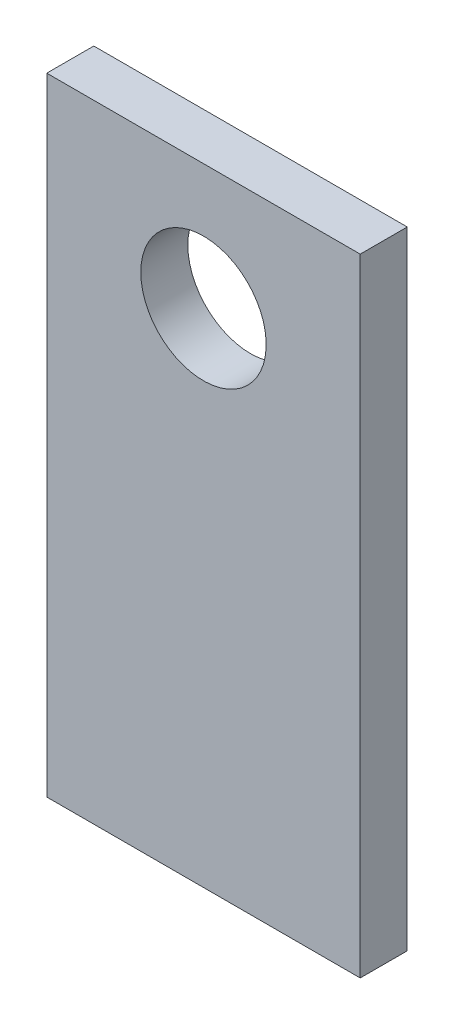
ISO-10303-21;
HEADER;
FILE_DESCRIPTION(('STEP AP214'),'2;1');
FILE_NAME('part.step','',(''),(''),'','','');
FILE_SCHEMA(('AUTOMOTIVE_DESIGN { 1 0 10303 214 1 1 1 1 }'));
ENDSEC;
DATA;
#1=APPLICATION_CONTEXT('core data for automotive mechanical design processes');
#2=APPLICATION_PROTOCOL_DEFINITION('international standard','automotive_design',2000,#1);
#3=PRODUCT_CONTEXT('',#1,'mechanical');
#4=PRODUCT('Part','Part','',(#3));
#5=PRODUCT_RELATED_PRODUCT_CATEGORY('part','',(#4));
#6=PRODUCT_DEFINITION_FORMATION('','',#4);
#7=PRODUCT_DEFINITION_CONTEXT('part definition',#1,'design');
#8=PRODUCT_DEFINITION('design','',#6,#7);
#9=PRODUCT_DEFINITION_SHAPE('','',#8);
#10=(LENGTH_UNIT() NAMED_UNIT(*) SI_UNIT(.MILLI.,.METRE.));
#11=(NAMED_UNIT(*) PLANE_ANGLE_UNIT() SI_UNIT($,.RADIAN.));
#12=(NAMED_UNIT(*) SI_UNIT($,.STERADIAN.) SOLID_ANGLE_UNIT());
#13=UNCERTAINTY_MEASURE_WITH_UNIT(LENGTH_MEASURE(1.E-05),#10,'distance_accuracy_value','');
#14=(GEOMETRIC_REPRESENTATION_CONTEXT(3) GLOBAL_UNCERTAINTY_ASSIGNED_CONTEXT((#13)) GLOBAL_UNIT_ASSIGNED_CONTEXT((#10,
#11,#12)) REPRESENTATION_CONTEXT('',''));
#15=CARTESIAN_POINT('',(0.,0.,0.));
#16=DIRECTION('',(0.,0.,1.));
#17=DIRECTION('',(1.,0.,0.));
#18=AXIS2_PLACEMENT_3D('',#15,#16,#17);
#19=CARTESIAN_POINT('',(0.,0.,9.525));
#20=DIRECTION('',(0.,0.,-1.));
#21=DIRECTION('',(-1.,0.,0.));
#22=AXIS2_PLACEMENT_3D('',#19,#20,#21);
#23=PLANE('',#22);
#24=DIRECTION('',(0.,-1.,0.));
#25=VECTOR('',#24,1.);
#26=CARTESIAN_POINT('',(0.,0.,9.525));
#27=LINE('',#26,#25);
#28=CARTESIAN_POINT('',(0.,127.,9.525));
#29=VERTEX_POINT('',#28);
#30=CARTESIAN_POINT('',(0.,0.,9.525));
#31=VERTEX_POINT('',#30);
#32=EDGE_CURVE('E85',#29,#31,#27,.T.);
#33=ORIENTED_EDGE('',*,*,#32,.T.);
#34=DIRECTION('',(1.,0.,0.));
#35=VECTOR('',#34,1.);
#36=CARTESIAN_POINT('',(0.,0.,9.525));
#37=LINE('',#36,#35);
#38=CARTESIAN_POINT('',(63.5,0.,9.525));
#39=VERTEX_POINT('',#38);
#40=EDGE_CURVE('E80',#31,#39,#37,.T.);
#41=ORIENTED_EDGE('',*,*,#40,.T.);
#42=DIRECTION('',(0.,1.,0.));
#43=VECTOR('',#42,1.);
#44=CARTESIAN_POINT('',(63.5,0.,9.525));
#45=LINE('',#44,#43);
#46=CARTESIAN_POINT('',(63.5,127.,9.525));
#47=VERTEX_POINT('',#46);
#48=EDGE_CURVE('E83',#39,#47,#45,.T.);
#49=ORIENTED_EDGE('',*,*,#48,.T.);
#50=DIRECTION('',(-1.,0.,0.));
#51=VECTOR('',#50,1.);
#52=CARTESIAN_POINT('',(0.,127.,9.525));
#53=LINE('',#52,#51);
#54=EDGE_CURVE('E50',#47,#29,#53,.T.);
#55=ORIENTED_EDGE('',*,*,#54,.T.);
#56=EDGE_LOOP('',(#33,#41,#49,#55));
#57=FACE_BOUND('',#56,.T.);
#58=CARTESIAN_POINT('',(31.75,101.6,9.525));
#59=DIRECTION('',(0.,0.,1.));
#60=DIRECTION('',(1.,0.,0.));
#61=AXIS2_PLACEMENT_3D('',#58,#59,#60);
#62=CIRCLE('',#61,12.7);
#63=CARTESIAN_POINT('',(19.05,101.6,9.525));
#64=VERTEX_POINT('',#63);
#65=EDGE_CURVE('E100',#64,#64,#62,.T.);
#66=ORIENTED_EDGE('',*,*,#65,.F.);
#67=EDGE_LOOP('',(#66));
#68=FACE_BOUND('',#67,.T.);
#69=ADVANCED_FACE('F33',(#57,#68),#23,.F.);
#70=CARTESIAN_POINT('',(0.,0.,0.));
#71=DIRECTION('',(0.,0.,-1.));
#72=DIRECTION('',(-1.,0.,0.));
#73=AXIS2_PLACEMENT_3D('',#70,#71,#72);
#74=PLANE('',#73);
#75=DIRECTION('',(0.,-1.,0.));
#76=VECTOR('',#75,1.);
#77=CARTESIAN_POINT('',(0.,0.,0.));
#78=LINE('',#77,#76);
#79=CARTESIAN_POINT('',(0.,127.,0.));
#80=VERTEX_POINT('',#79);
#81=CARTESIAN_POINT('',(0.,0.,0.));
#82=VERTEX_POINT('',#81);
#83=EDGE_CURVE('E97',#80,#82,#78,.T.);
#84=ORIENTED_EDGE('',*,*,#83,.F.);
#85=DIRECTION('',(-1.,0.,0.));
#86=VECTOR('',#85,1.);
#87=CARTESIAN_POINT('',(0.,127.,0.));
#88=LINE('',#87,#86);
#89=CARTESIAN_POINT('',(63.5,127.,0.));
#90=VERTEX_POINT('',#89);
#91=EDGE_CURVE('E73',#90,#80,#88,.T.);
#92=ORIENTED_EDGE('',*,*,#91,.F.);
#93=DIRECTION('',(0.,1.,0.));
#94=VECTOR('',#93,1.);
#95=CARTESIAN_POINT('',(63.5,0.,0.));
#96=LINE('',#95,#94);
#97=CARTESIAN_POINT('',(63.5,0.,0.));
#98=VERTEX_POINT('',#97);
#99=EDGE_CURVE('E67',#98,#90,#96,.T.);
#100=ORIENTED_EDGE('',*,*,#99,.F.);
#101=DIRECTION('',(1.,0.,0.));
#102=VECTOR('',#101,1.);
#103=CARTESIAN_POINT('',(0.,0.,0.));
#104=LINE('',#103,#102);
#105=EDGE_CURVE('E89',#82,#98,#104,.T.);
#106=ORIENTED_EDGE('',*,*,#105,.F.);
#107=EDGE_LOOP('',(#84,#92,#100,#106));
#108=FACE_BOUND('',#107,.T.);
#109=CARTESIAN_POINT('',(31.75,101.6,0.));
#110=DIRECTION('',(0.,0.,1.));
#111=DIRECTION('',(1.,0.,0.));
#112=AXIS2_PLACEMENT_3D('',#109,#110,#111);
#113=CIRCLE('',#112,12.7);
#114=CARTESIAN_POINT('',(19.05,101.6,0.));
#115=VERTEX_POINT('',#114);
#116=EDGE_CURVE('E112',#115,#115,#113,.T.);
#117=ORIENTED_EDGE('',*,*,#116,.T.);
#118=EDGE_LOOP('',(#117));
#119=FACE_BOUND('',#118,.T.);
#120=ADVANCED_FACE('F108',(#108,#119),#74,.T.);
#121=CARTESIAN_POINT('',(0.,0.,9.525));
#122=DIRECTION('',(1.,0.,0.));
#123=DIRECTION('',(0.,0.,-1.));
#124=AXIS2_PLACEMENT_3D('',#121,#122,#123);
#125=PLANE('',#124);
#126=ORIENTED_EDGE('',*,*,#83,.T.);
#127=DIRECTION('',(0.,0.,-1.));
#128=VECTOR('',#127,1.);
#129=CARTESIAN_POINT('',(0.,0.,9.525));
#130=LINE('',#129,#128);
#131=EDGE_CURVE('E11',#31,#82,#130,.T.);
#132=ORIENTED_EDGE('',*,*,#131,.F.);
#133=ORIENTED_EDGE('',*,*,#32,.F.);
#134=DIRECTION('',(0.,0.,-1.));
#135=VECTOR('',#134,1.);
#136=CARTESIAN_POINT('',(0.,127.,9.525));
#137=LINE('',#136,#135);
#138=EDGE_CURVE('E93',#29,#80,#137,.T.);
#139=ORIENTED_EDGE('',*,*,#138,.T.);
#140=EDGE_LOOP('',(#126,#132,#133,#139));
#141=FACE_BOUND('',#140,.T.);
#142=ADVANCED_FACE('F35',(#141),#125,.F.);
#143=CARTESIAN_POINT('',(0.,0.,9.525));
#144=DIRECTION('',(0.,1.,0.));
#145=DIRECTION('',(0.,0.,1.));
#146=AXIS2_PLACEMENT_3D('',#143,#144,#145);
#147=PLANE('',#146);
#148=ORIENTED_EDGE('',*,*,#105,.T.);
#149=DIRECTION('',(0.,0.,-1.));
#150=VECTOR('',#149,1.);
#151=CARTESIAN_POINT('',(63.5,0.,9.525));
#152=LINE('',#151,#150);
#153=EDGE_CURVE('E42',#39,#98,#152,.T.);
#154=ORIENTED_EDGE('',*,*,#153,.F.);
#155=ORIENTED_EDGE('',*,*,#40,.F.);
#156=ORIENTED_EDGE('',*,*,#131,.T.);
#157=EDGE_LOOP('',(#148,#154,#155,#156));
#158=FACE_BOUND('',#157,.T.);
#159=ADVANCED_FACE('F88',(#158),#147,.F.);
#160=CARTESIAN_POINT('',(63.5,0.,9.525));
#161=DIRECTION('',(-1.,0.,0.));
#162=DIRECTION('',(0.,0.,1.));
#163=AXIS2_PLACEMENT_3D('',#160,#161,#162);
#164=PLANE('',#163);
#165=ORIENTED_EDGE('',*,*,#99,.T.);
#166=DIRECTION('',(0.,0.,-1.));
#167=VECTOR('',#166,1.);
#168=CARTESIAN_POINT('',(63.5,127.,9.525));
#169=LINE('',#168,#167);
#170=EDGE_CURVE('E90',#47,#90,#169,.T.);
#171=ORIENTED_EDGE('',*,*,#170,.F.);
#172=ORIENTED_EDGE('',*,*,#48,.F.);
#173=ORIENTED_EDGE('',*,*,#153,.T.);
#174=EDGE_LOOP('',(#165,#171,#172,#173));
#175=FACE_BOUND('',#174,.T.);
#176=ADVANCED_FACE('F91',(#175),#164,.F.);
#177=CARTESIAN_POINT('',(0.,127.,9.525));
#178=DIRECTION('',(0.,-1.,0.));
#179=DIRECTION('',(0.,0.,-1.));
#180=AXIS2_PLACEMENT_3D('',#177,#178,#179);
#181=PLANE('',#180);
#182=ORIENTED_EDGE('',*,*,#91,.T.);
#183=ORIENTED_EDGE('',*,*,#138,.F.);
#184=ORIENTED_EDGE('',*,*,#54,.F.);
#185=ORIENTED_EDGE('',*,*,#170,.T.);
#186=EDGE_LOOP('',(#182,#183,#184,#185));
#187=FACE_BOUND('',#186,.T.);
#188=ADVANCED_FACE('F105',(#187),#181,.F.);
#189=CARTESIAN_POINT('',(31.75,101.6,9.525));
#190=DIRECTION('',(0.,0.,-1.));
#191=DIRECTION('',(-1.,0.,0.));
#192=AXIS2_PLACEMENT_3D('',#189,#190,#191);
#193=CYLINDRICAL_SURFACE('',#192,12.7);
#194=CARTESIAN_POINT('',(19.05,101.6,9.525));
#195=CARTESIAN_POINT('',(19.05,101.6,9.42578125));
#196=CARTESIAN_POINT('',(19.05,101.6,9.3265625));
#197=CARTESIAN_POINT('',(19.05,101.6,9.128125));
#198=CARTESIAN_POINT('',(19.05,101.6,9.02890625));
#199=CARTESIAN_POINT('',(19.05,101.6,8.83046875));
#200=CARTESIAN_POINT('',(19.05,101.6,8.73125));
#201=CARTESIAN_POINT('',(19.05,101.6,8.5328125));
#202=CARTESIAN_POINT('',(19.05,101.6,8.43359375));
#203=CARTESIAN_POINT('',(19.05,101.6,8.23515625));
#204=CARTESIAN_POINT('',(19.05,101.6,8.1359375));
#205=CARTESIAN_POINT('',(19.05,101.6,7.9375));
#206=CARTESIAN_POINT('',(19.05,101.6,7.83828125));
#207=CARTESIAN_POINT('',(19.05,101.6,7.63984375));
#208=CARTESIAN_POINT('',(19.05,101.6,7.540625));
#209=CARTESIAN_POINT('',(19.05,101.6,7.3421875));
#210=CARTESIAN_POINT('',(19.05,101.6,7.24296875));
#211=CARTESIAN_POINT('',(19.05,101.6,7.04453125));
#212=CARTESIAN_POINT('',(19.05,101.6,6.9453125));
#213=CARTESIAN_POINT('',(19.05,101.6,6.746875));
#214=CARTESIAN_POINT('',(19.05,101.6,6.64765625));
#215=CARTESIAN_POINT('',(19.05,101.6,6.44921875));
#216=CARTESIAN_POINT('',(19.05,101.6,6.35));
#217=CARTESIAN_POINT('',(19.05,101.6,6.1515625));
#218=CARTESIAN_POINT('',(19.05,101.6,6.05234375));
#219=CARTESIAN_POINT('',(19.05,101.6,5.85390625));
#220=CARTESIAN_POINT('',(19.05,101.6,5.7546875));
#221=CARTESIAN_POINT('',(19.05,101.6,5.55625));
#222=CARTESIAN_POINT('',(19.05,101.6,5.45703125));
#223=CARTESIAN_POINT('',(19.05,101.6,5.25859375));
#224=CARTESIAN_POINT('',(19.05,101.6,5.159375));
#225=CARTESIAN_POINT('',(19.05,101.6,4.9609375));
#226=CARTESIAN_POINT('',(19.05,101.6,4.86171875));
#227=CARTESIAN_POINT('',(19.05,101.6,4.66328125));
#228=CARTESIAN_POINT('',(19.05,101.6,4.5640625));
#229=CARTESIAN_POINT('',(19.05,101.6,4.365625));
#230=CARTESIAN_POINT('',(19.05,101.6,4.26640625));
#231=CARTESIAN_POINT('',(19.05,101.6,4.06796875));
#232=CARTESIAN_POINT('',(19.05,101.6,3.96875));
#233=CARTESIAN_POINT('',(19.05,101.6,3.7703125));
#234=CARTESIAN_POINT('',(19.05,101.6,3.67109375));
#235=CARTESIAN_POINT('',(19.05,101.6,3.47265625));
#236=CARTESIAN_POINT('',(19.05,101.6,3.3734375));
#237=CARTESIAN_POINT('',(19.05,101.6,3.175));
#238=CARTESIAN_POINT('',(19.05,101.6,3.07578125));
#239=CARTESIAN_POINT('',(19.05,101.6,2.87734375));
#240=CARTESIAN_POINT('',(19.05,101.6,2.778125));
#241=CARTESIAN_POINT('',(19.05,101.6,2.5796875));
#242=CARTESIAN_POINT('',(19.05,101.6,2.48046875));
#243=CARTESIAN_POINT('',(19.05,101.6,2.28203125));
#244=CARTESIAN_POINT('',(19.05,101.6,2.1828125));
#245=CARTESIAN_POINT('',(19.05,101.6,1.984375));
#246=CARTESIAN_POINT('',(19.05,101.6,1.88515625));
#247=CARTESIAN_POINT('',(19.05,101.6,1.68671875));
#248=CARTESIAN_POINT('',(19.05,101.6,1.5875));
#249=CARTESIAN_POINT('',(19.05,101.6,1.3890625));
#250=CARTESIAN_POINT('',(19.05,101.6,1.28984375));
#251=CARTESIAN_POINT('',(19.05,101.6,1.09140625));
#252=CARTESIAN_POINT('',(19.05,101.6,0.992187500000001));
#253=CARTESIAN_POINT('',(19.05,101.6,0.793750000000001));
#254=CARTESIAN_POINT('',(19.05,101.6,0.69453125));
#255=CARTESIAN_POINT('',(19.05,101.6,0.49609375));
#256=CARTESIAN_POINT('',(19.05,101.6,0.396875));
#257=CARTESIAN_POINT('',(19.05,101.6,0.1984375));
#258=CARTESIAN_POINT('',(19.05,101.6,0.0992187500000001));
#259=CARTESIAN_POINT('',(19.05,101.6,0.));
#260=B_SPLINE_CURVE_WITH_KNOTS('',3,(#194,#195,#196,#197,#198,#199,#200,#201,#202,#203,#204,
#205,#206,#207,#208,#209,#210,#211,#212,#213,#214,#215,#216,#217,#218,#219,#220,#221,#222,#223,
#224,#225,#226,#227,#228,#229,#230,#231,#232,#233,#234,#235,#236,#237,#238,#239,#240,#241,#242,
#243,#244,#245,#246,#247,#248,#249,#250,#251,#252,#253,#254,#255,#256,#257,#258,#259),
.UNSPECIFIED.,.F.,.F.,(4,2,2,2,2,2,2,2,2,2,2,2,2,2,2,2,2,2,2,2,2,2,2,2,2,2,2,2,2,2,2,2,4),(0.,
0.29765625,0.5953125,0.892968750000001,1.190625,1.48828125,1.7859375,2.08359375,2.38125,
2.67890625,2.9765625,3.27421875,3.571875,3.86953125,4.1671875,4.46484375,4.7625,5.06015625,
5.3578125,5.65546875,5.953125,6.25078125,6.5484375,6.84609375,7.14375,7.44140625,7.7390625,
8.03671875,8.334375,8.63203125,8.9296875,9.22734375,9.525),.UNSPECIFIED.);
#261=EDGE_CURVE('BSEAM118',#64,#115,#260,.T.);
#262=ORIENTED_EDGE('',*,*,#65,.T.);
#263=ORIENTED_EDGE('',*,*,#116,.F.);
#264=ORIENTED_EDGE('',*,*,#261,.T.);
#265=ORIENTED_EDGE('',*,*,#261,.F.);
#266=EDGE_LOOP('',(#262,#264,#263,#265));
#267=FACE_BOUND('',#266,.T.);
#268=ADVANCED_FACE('F118',(#267),#193,.F.);
#269=CLOSED_SHELL('',(#69,#120,#142,#159,#176,#188,#268));
#270=MANIFOLD_SOLID_BREP('B2',#269);
#271=ADVANCED_BREP_SHAPE_REPRESENTATION('',(#18,#270),#14);
#272=SHAPE_DEFINITION_REPRESENTATION(#9,#271);
ENDSEC;
END-ISO-10303-21;
